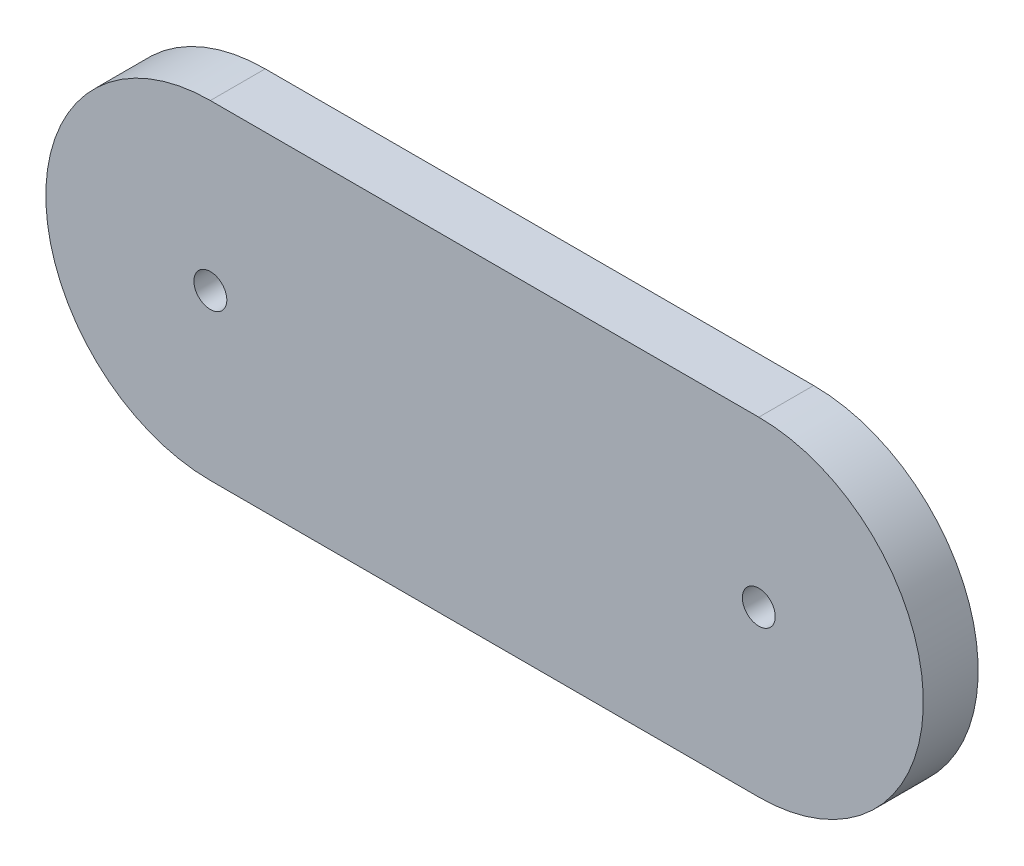
ISO-10303-21;
HEADER;
FILE_DESCRIPTION(('STEP AP214'),'2;1');
FILE_NAME('part.step','',(''),(''),'','','');
FILE_SCHEMA(('AUTOMOTIVE_DESIGN { 1 0 10303 214 1 1 1 1 }'));
ENDSEC;
DATA;
#1=APPLICATION_CONTEXT('core data for automotive mechanical design processes');
#2=APPLICATION_PROTOCOL_DEFINITION('international standard','automotive_design',2000,#1);
#3=PRODUCT_CONTEXT('',#1,'mechanical');
#4=PRODUCT('Part','Part','',(#3));
#5=PRODUCT_RELATED_PRODUCT_CATEGORY('part','',(#4));
#6=PRODUCT_DEFINITION_FORMATION('','',#4);
#7=PRODUCT_DEFINITION_CONTEXT('part definition',#1,'design');
#8=PRODUCT_DEFINITION('design','',#6,#7);
#9=PRODUCT_DEFINITION_SHAPE('','',#8);
#10=(LENGTH_UNIT() NAMED_UNIT(*) SI_UNIT(.MILLI.,.METRE.));
#11=(NAMED_UNIT(*) PLANE_ANGLE_UNIT() SI_UNIT($,.RADIAN.));
#12=(NAMED_UNIT(*) SI_UNIT($,.STERADIAN.) SOLID_ANGLE_UNIT());
#13=UNCERTAINTY_MEASURE_WITH_UNIT(LENGTH_MEASURE(1.E-05),#10,'distance_accuracy_value','');
#14=(GEOMETRIC_REPRESENTATION_CONTEXT(3) GLOBAL_UNCERTAINTY_ASSIGNED_CONTEXT((#13)) GLOBAL_UNIT_ASSIGNED_CONTEXT((#10,
#11,#12)) REPRESENTATION_CONTEXT('',''));
#15=CARTESIAN_POINT('',(0.,0.,0.));
#16=DIRECTION('',(0.,0.,1.));
#17=DIRECTION('',(1.,0.,0.));
#18=AXIS2_PLACEMENT_3D('',#15,#16,#17);
#19=CARTESIAN_POINT('',(0.,0.,5.));
#20=DIRECTION('',(0.,0.,-1.));
#21=DIRECTION('',(-1.,0.,0.));
#22=AXIS2_PLACEMENT_3D('',#19,#20,#21);
#23=CYLINDRICAL_SURFACE('',#22,15.);
#24=CARTESIAN_POINT('',(0.,0.,0.));
#25=DIRECTION('',(0.,0.,1.));
#26=DIRECTION('',(1.,0.,0.));
#27=AXIS2_PLACEMENT_3D('',#24,#25,#26);
#28=CIRCLE('',#27,15.);
#29=CARTESIAN_POINT('',(0.,15.,0.));
#30=VERTEX_POINT('',#29);
#31=CARTESIAN_POINT('',(0.,-15.,0.));
#32=VERTEX_POINT('',#31);
#33=EDGE_CURVE('E107',#30,#32,#28,.T.);
#34=ORIENTED_EDGE('',*,*,#33,.T.);
#35=DIRECTION('',(0.,0.,-1.));
#36=VECTOR('',#35,1.);
#37=CARTESIAN_POINT('',(0.,-15.,5.));
#38=LINE('',#37,#36);
#39=CARTESIAN_POINT('',(0.,-15.,5.));
#40=VERTEX_POINT('',#39);
#41=EDGE_CURVE('E11',#40,#32,#38,.T.);
#42=ORIENTED_EDGE('',*,*,#41,.F.);
#43=CARTESIAN_POINT('',(0.,0.,5.));
#44=DIRECTION('',(0.,0.,1.));
#45=DIRECTION('',(1.,0.,0.));
#46=AXIS2_PLACEMENT_3D('',#43,#44,#45);
#47=CIRCLE('',#46,15.);
#48=CARTESIAN_POINT('',(0.,15.,5.));
#49=VERTEX_POINT('',#48);
#50=EDGE_CURVE('E91',#49,#40,#47,.T.);
#51=ORIENTED_EDGE('',*,*,#50,.F.);
#52=DIRECTION('',(0.,0.,-1.));
#53=VECTOR('',#52,1.);
#54=CARTESIAN_POINT('',(0.,15.,5.));
#55=LINE('',#54,#53);
#56=EDGE_CURVE('E103',#49,#30,#55,.T.);
#57=ORIENTED_EDGE('',*,*,#56,.T.);
#58=EDGE_LOOP('',(#34,#42,#51,#57));
#59=FACE_BOUND('',#58,.T.);
#60=ADVANCED_FACE('F39',(#59),#23,.T.);
#61=CARTESIAN_POINT('',(0.,-15.,5.));
#62=DIRECTION('',(0.,1.,0.));
#63=DIRECTION('',(0.,0.,1.));
#64=AXIS2_PLACEMENT_3D('',#61,#62,#63);
#65=PLANE('',#64);
#66=DIRECTION('',(1.,0.,0.));
#67=VECTOR('',#66,1.);
#68=CARTESIAN_POINT('',(0.,-15.,0.));
#69=LINE('',#68,#67);
#70=CARTESIAN_POINT('',(50.,-15.,0.));
#71=VERTEX_POINT('',#70);
#72=EDGE_CURVE('E96',#32,#71,#69,.T.);
#73=ORIENTED_EDGE('',*,*,#72,.T.);
#74=DIRECTION('',(0.,0.,-1.));
#75=VECTOR('',#74,1.);
#76=CARTESIAN_POINT('',(50.,-15.,5.));
#77=LINE('',#76,#75);
#78=CARTESIAN_POINT('',(50.,-15.,5.));
#79=VERTEX_POINT('',#78);
#80=EDGE_CURVE('E48',#79,#71,#77,.T.);
#81=ORIENTED_EDGE('',*,*,#80,.F.);
#82=DIRECTION('',(1.,0.,0.));
#83=VECTOR('',#82,1.);
#84=CARTESIAN_POINT('',(0.,-15.,5.));
#85=LINE('',#84,#83);
#86=EDGE_CURVE('E86',#40,#79,#85,.T.);
#87=ORIENTED_EDGE('',*,*,#86,.F.);
#88=ORIENTED_EDGE('',*,*,#41,.T.);
#89=EDGE_LOOP('',(#73,#81,#87,#88));
#90=FACE_BOUND('',#89,.T.);
#91=ADVANCED_FACE('F95',(#90),#65,.F.);
#92=CARTESIAN_POINT('',(50.,0.,5.));
#93=DIRECTION('',(0.,0.,-1.));
#94=DIRECTION('',(-1.,0.,0.));
#95=AXIS2_PLACEMENT_3D('',#92,#93,#94);
#96=CYLINDRICAL_SURFACE('',#95,15.);
#97=CARTESIAN_POINT('',(50.,0.,0.));
#98=DIRECTION('',(0.,0.,1.));
#99=DIRECTION('',(1.,0.,0.));
#100=AXIS2_PLACEMENT_3D('',#97,#98,#99);
#101=CIRCLE('',#100,15.);
#102=CARTESIAN_POINT('',(50.,15.,0.));
#103=VERTEX_POINT('',#102);
#104=EDGE_CURVE('E73',#71,#103,#101,.T.);
#105=ORIENTED_EDGE('',*,*,#104,.T.);
#106=DIRECTION('',(0.,0.,-1.));
#107=VECTOR('',#106,1.);
#108=CARTESIAN_POINT('',(50.,15.,5.));
#109=LINE('',#108,#107);
#110=CARTESIAN_POINT('',(50.,15.,5.));
#111=VERTEX_POINT('',#110);
#112=EDGE_CURVE('E98',#111,#103,#109,.T.);
#113=ORIENTED_EDGE('',*,*,#112,.F.);
#114=CARTESIAN_POINT('',(50.,0.,5.));
#115=DIRECTION('',(0.,0.,1.));
#116=DIRECTION('',(1.,0.,0.));
#117=AXIS2_PLACEMENT_3D('',#114,#115,#116);
#118=CIRCLE('',#117,15.);
#119=EDGE_CURVE('E89',#79,#111,#118,.T.);
#120=ORIENTED_EDGE('',*,*,#119,.F.);
#121=ORIENTED_EDGE('',*,*,#80,.T.);
#122=EDGE_LOOP('',(#105,#113,#120,#121));
#123=FACE_BOUND('',#122,.T.);
#124=ADVANCED_FACE('F99',(#123),#96,.T.);
#125=CARTESIAN_POINT('',(0.,15.,5.));
#126=DIRECTION('',(0.,-1.,0.));
#127=DIRECTION('',(0.,0.,-1.));
#128=AXIS2_PLACEMENT_3D('',#125,#126,#127);
#129=PLANE('',#128);
#130=DIRECTION('',(-1.,0.,0.));
#131=VECTOR('',#130,1.);
#132=CARTESIAN_POINT('',(0.,15.,0.));
#133=LINE('',#132,#131);
#134=EDGE_CURVE('E79',#103,#30,#133,.T.);
#135=ORIENTED_EDGE('',*,*,#134,.T.);
#136=ORIENTED_EDGE('',*,*,#56,.F.);
#137=DIRECTION('',(-1.,0.,0.));
#138=VECTOR('',#137,1.);
#139=CARTESIAN_POINT('',(0.,15.,5.));
#140=LINE('',#139,#138);
#141=EDGE_CURVE('E56',#111,#49,#140,.T.);
#142=ORIENTED_EDGE('',*,*,#141,.F.);
#143=ORIENTED_EDGE('',*,*,#112,.T.);
#144=EDGE_LOOP('',(#135,#136,#142,#143));
#145=FACE_BOUND('',#144,.T.);
#146=ADVANCED_FACE('F121',(#145),#129,.F.);
#147=CARTESIAN_POINT('',(0.,0.,5.));
#148=DIRECTION('',(0.,0.,1.));
#149=DIRECTION('',(1.,0.,0.));
#150=AXIS2_PLACEMENT_3D('',#147,#148,#149);
#151=PLANE('',#150);
#152=CARTESIAN_POINT('',(50.,0.,5.));
#153=DIRECTION('',(0.,0.,-1.));
#154=DIRECTION('',(-1.,0.,0.));
#155=AXIS2_PLACEMENT_3D('',#152,#153,#154);
#156=CIRCLE('',#155,1.5);
#157=CARTESIAN_POINT('',(48.5,0.,5.));
#158=VERTEX_POINT('',#157);
#159=EDGE_CURVE('E111',#158,#158,#156,.T.);
#160=ORIENTED_EDGE('',*,*,#159,.T.);
#161=EDGE_LOOP('',(#160));
#162=FACE_BOUND('',#161,.T.);
#163=CARTESIAN_POINT('',(0.,0.,5.));
#164=DIRECTION('',(0.,0.,-1.));
#165=DIRECTION('',(-1.,0.,0.));
#166=AXIS2_PLACEMENT_3D('',#163,#164,#165);
#167=CIRCLE('',#166,1.5);
#168=CARTESIAN_POINT('',(-1.5,0.,5.));
#169=VERTEX_POINT('',#168);
#170=EDGE_CURVE('E132',#169,#169,#167,.T.);
#171=ORIENTED_EDGE('',*,*,#170,.T.);
#172=EDGE_LOOP('',(#171));
#173=FACE_BOUND('',#172,.T.);
#174=ORIENTED_EDGE('',*,*,#50,.T.);
#175=ORIENTED_EDGE('',*,*,#86,.T.);
#176=ORIENTED_EDGE('',*,*,#119,.T.);
#177=ORIENTED_EDGE('',*,*,#141,.T.);
#178=EDGE_LOOP('',(#174,#175,#176,#177));
#179=FACE_BOUND('',#178,.T.);
#180=ADVANCED_FACE('F87',(#162,#173,#179),#151,.T.);
#181=CARTESIAN_POINT('',(0.,0.,0.));
#182=DIRECTION('',(0.,0.,1.));
#183=DIRECTION('',(1.,0.,0.));
#184=AXIS2_PLACEMENT_3D('',#181,#182,#183);
#185=PLANE('',#184);
#186=CARTESIAN_POINT('',(50.,0.,0.));
#187=DIRECTION('',(0.,0.,-1.));
#188=DIRECTION('',(-1.,0.,0.));
#189=AXIS2_PLACEMENT_3D('',#186,#187,#188);
#190=CIRCLE('',#189,1.5);
#191=CARTESIAN_POINT('',(48.5,0.,0.));
#192=VERTEX_POINT('',#191);
#193=EDGE_CURVE('E136',#192,#192,#190,.T.);
#194=ORIENTED_EDGE('',*,*,#193,.F.);
#195=EDGE_LOOP('',(#194));
#196=FACE_BOUND('',#195,.T.);
#197=CARTESIAN_POINT('',(0.,0.,0.));
#198=DIRECTION('',(0.,0.,-1.));
#199=DIRECTION('',(-1.,0.,0.));
#200=AXIS2_PLACEMENT_3D('',#197,#198,#199);
#201=CIRCLE('',#200,1.5);
#202=CARTESIAN_POINT('',(-1.5,0.,0.));
#203=VERTEX_POINT('',#202);
#204=EDGE_CURVE('E128',#203,#203,#201,.T.);
#205=ORIENTED_EDGE('',*,*,#204,.F.);
#206=EDGE_LOOP('',(#205));
#207=FACE_BOUND('',#206,.T.);
#208=ORIENTED_EDGE('',*,*,#33,.F.);
#209=ORIENTED_EDGE('',*,*,#134,.F.);
#210=ORIENTED_EDGE('',*,*,#104,.F.);
#211=ORIENTED_EDGE('',*,*,#72,.F.);
#212=EDGE_LOOP('',(#208,#209,#210,#211));
#213=FACE_BOUND('',#212,.T.);
#214=ADVANCED_FACE('F124',(#196,#207,#213),#185,.F.);
#215=CARTESIAN_POINT('',(0.,0.,5.));
#216=DIRECTION('',(0.,0.,-1.));
#217=DIRECTION('',(-1.,0.,0.));
#218=AXIS2_PLACEMENT_3D('',#215,#216,#217);
#219=CYLINDRICAL_SURFACE('',#218,1.5);
#220=ORIENTED_EDGE('',*,*,#170,.F.);
#221=EDGE_LOOP('',(#220));
#222=FACE_BOUND('',#221,.T.);
#223=ORIENTED_EDGE('',*,*,#204,.T.);
#224=EDGE_LOOP('',(#223));
#225=FACE_BOUND('',#224,.T.);
#226=ADVANCED_FACE('F149',(#222,#225),#219,.F.);
#227=CARTESIAN_POINT('',(50.,0.,5.));
#228=DIRECTION('',(0.,0.,-1.));
#229=DIRECTION('',(-1.,0.,0.));
#230=AXIS2_PLACEMENT_3D('',#227,#228,#229);
#231=CYLINDRICAL_SURFACE('',#230,1.5);
#232=ORIENTED_EDGE('',*,*,#159,.F.);
#233=EDGE_LOOP('',(#232));
#234=FACE_BOUND('',#233,.T.);
#235=ORIENTED_EDGE('',*,*,#193,.T.);
#236=EDGE_LOOP('',(#235));
#237=FACE_BOUND('',#236,.T.);
#238=ADVANCED_FACE('F146',(#234,#237),#231,.F.);
#239=CLOSED_SHELL('',(#60,#91,#124,#146,#180,#214,#226,#238));
#240=MANIFOLD_SOLID_BREP('B2',#239);
#241=ADVANCED_BREP_SHAPE_REPRESENTATION('',(#18,#240),#14);
#242=SHAPE_DEFINITION_REPRESENTATION(#9,#241);
ENDSEC;
END-ISO-10303-21;
